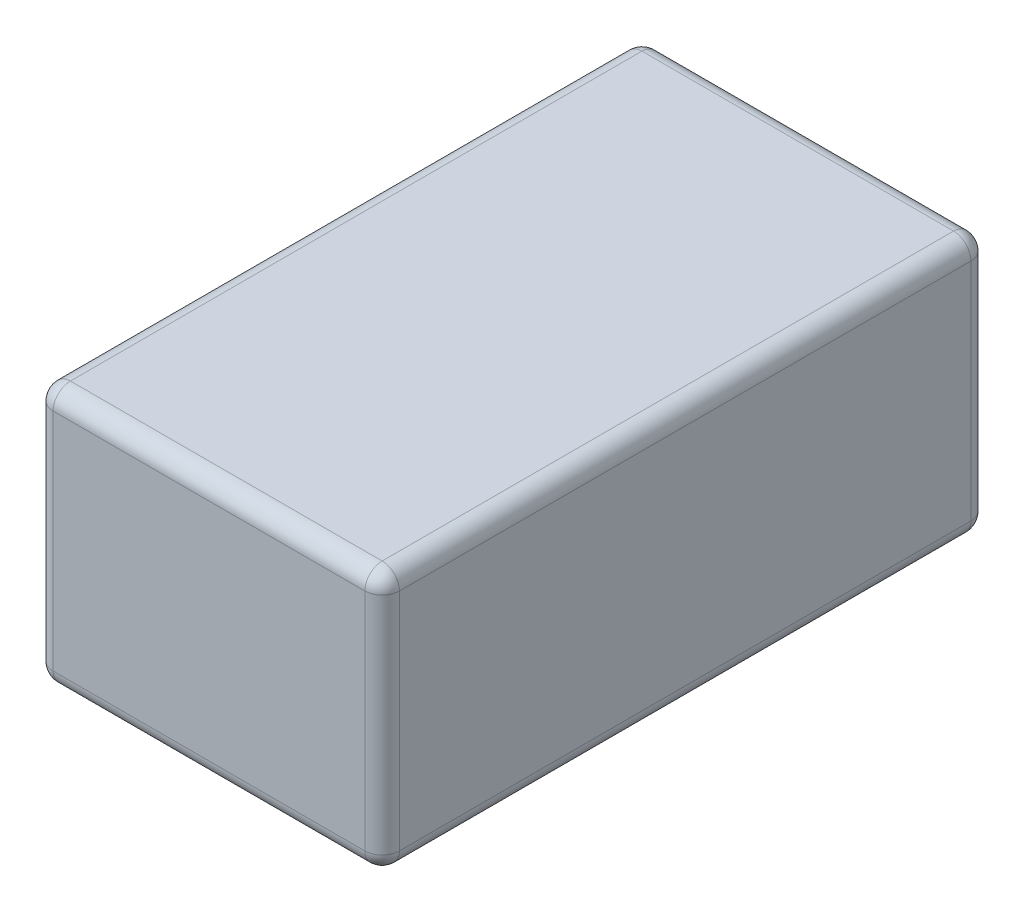
ISO-10303-21;
HEADER;
FILE_DESCRIPTION(('STEP AP214'),'2;1');
FILE_NAME('part.step','',(''),(''),'','','');
FILE_SCHEMA(('AUTOMOTIVE_DESIGN { 1 0 10303 214 1 1 1 1 }'));
ENDSEC;
DATA;
#1=APPLICATION_CONTEXT('core data for automotive mechanical design processes');
#2=APPLICATION_PROTOCOL_DEFINITION('international standard','automotive_design',2000,#1);
#3=PRODUCT_CONTEXT('',#1,'mechanical');
#4=PRODUCT('Part','Part','',(#3));
#5=PRODUCT_RELATED_PRODUCT_CATEGORY('part','',(#4));
#6=PRODUCT_DEFINITION_FORMATION('','',#4);
#7=PRODUCT_DEFINITION_CONTEXT('part definition',#1,'design');
#8=PRODUCT_DEFINITION('design','',#6,#7);
#9=PRODUCT_DEFINITION_SHAPE('','',#8);
#10=(LENGTH_UNIT() NAMED_UNIT(*) SI_UNIT(.MILLI.,.METRE.));
#11=(NAMED_UNIT(*) PLANE_ANGLE_UNIT() SI_UNIT($,.RADIAN.));
#12=(NAMED_UNIT(*) SI_UNIT($,.STERADIAN.) SOLID_ANGLE_UNIT());
#13=UNCERTAINTY_MEASURE_WITH_UNIT(LENGTH_MEASURE(1.E-05),#10,'distance_accuracy_value','');
#14=(GEOMETRIC_REPRESENTATION_CONTEXT(3) GLOBAL_UNCERTAINTY_ASSIGNED_CONTEXT((#13)) GLOBAL_UNIT_ASSIGNED_CONTEXT((#10,
#11,#12)) REPRESENTATION_CONTEXT('',''));
#15=CARTESIAN_POINT('',(0.,0.,0.));
#16=DIRECTION('',(0.,0.,1.));
#17=DIRECTION('',(1.,0.,0.));
#18=AXIS2_PLACEMENT_3D('',#15,#16,#17);
#19=CARTESIAN_POINT('',(-10.,7.5,-17.5));
#20=DIRECTION('',(1.,0.,0.));
#21=DIRECTION('',(0.,0.,-1.));
#22=AXIS2_PLACEMENT_3D('',#19,#20,#21);
#23=PLANE('',#22);
#24=DIRECTION('',(0.,-1.,0.));
#25=VECTOR('',#24,1.);
#26=CARTESIAN_POINT('',(-10.,7.5,-16.5));
#27=LINE('',#26,#25);
#28=CARTESIAN_POINT('',(-10.,6.5,-16.5));
#29=VERTEX_POINT('',#28);
#30=CARTESIAN_POINT('',(-10.,-6.5,-16.5));
#31=VERTEX_POINT('',#30);
#32=EDGE_CURVE('E145',#29,#31,#27,.T.);
#33=ORIENTED_EDGE('',*,*,#32,.T.);
#34=DIRECTION('',(0.,0.,1.));
#35=VECTOR('',#34,1.);
#36=CARTESIAN_POINT('',(-10.,-6.5,-17.5));
#37=LINE('',#36,#35);
#38=CARTESIAN_POINT('',(-9.99999999999999,-6.5,16.5));
#39=VERTEX_POINT('',#38);
#40=EDGE_CURVE('E183',#31,#39,#37,.T.);
#41=ORIENTED_EDGE('',*,*,#40,.T.);
#42=DIRECTION('',(0.,-1.,0.));
#43=VECTOR('',#42,1.);
#44=CARTESIAN_POINT('',(-9.99999999999999,7.5,16.5));
#45=LINE('',#44,#43);
#46=CARTESIAN_POINT('',(-9.99999999999999,6.5,16.5));
#47=VERTEX_POINT('',#46);
#48=EDGE_CURVE('E180',#39,#47,#45,.F.);
#49=ORIENTED_EDGE('',*,*,#48,.T.);
#50=DIRECTION('',(0.,0.,1.));
#51=VECTOR('',#50,1.);
#52=CARTESIAN_POINT('',(-10.,6.5,-17.5));
#53=LINE('',#52,#51);
#54=EDGE_CURVE('E178',#47,#29,#53,.F.);
#55=ORIENTED_EDGE('',*,*,#54,.T.);
#56=EDGE_LOOP('',(#33,#41,#49,#55));
#57=FACE_BOUND('',#56,.T.);
#58=ADVANCED_FACE('F37',(#57),#23,.F.);
#59=CARTESIAN_POINT('',(-9.99999999999999,7.5,17.5));
#60=DIRECTION('',(0.,0.,-1.));
#61=DIRECTION('',(-1.,0.,0.));
#62=AXIS2_PLACEMENT_3D('',#59,#60,#61);
#63=PLANE('',#62);
#64=DIRECTION('',(0.,-1.,0.));
#65=VECTOR('',#64,1.);
#66=CARTESIAN_POINT('',(-8.99999999999999,7.5,17.5));
#67=LINE('',#66,#65);
#68=CARTESIAN_POINT('',(-8.99999999999999,6.5,17.5));
#69=VERTEX_POINT('',#68);
#70=CARTESIAN_POINT('',(-8.99999999999999,-6.5,17.5));
#71=VERTEX_POINT('',#70);
#72=EDGE_CURVE('E189',#69,#71,#67,.T.);
#73=ORIENTED_EDGE('',*,*,#72,.T.);
#74=DIRECTION('',(1.,0.,0.));
#75=VECTOR('',#74,1.);
#76=CARTESIAN_POINT('',(-9.99999999999999,-6.5,17.5));
#77=LINE('',#76,#75);
#78=CARTESIAN_POINT('',(9.00000000000001,-6.5,17.5));
#79=VERTEX_POINT('',#78);
#80=EDGE_CURVE('E192',#71,#79,#77,.T.);
#81=ORIENTED_EDGE('',*,*,#80,.T.);
#82=DIRECTION('',(0.,-1.,0.));
#83=VECTOR('',#82,1.);
#84=CARTESIAN_POINT('',(9.00000000000001,7.5,17.5));
#85=LINE('',#84,#83);
#86=CARTESIAN_POINT('',(9.00000000000001,6.5,17.5));
#87=VERTEX_POINT('',#86);
#88=EDGE_CURVE('E187',#79,#87,#85,.F.);
#89=ORIENTED_EDGE('',*,*,#88,.T.);
#90=DIRECTION('',(1.,0.,0.));
#91=VECTOR('',#90,1.);
#92=CARTESIAN_POINT('',(-9.99999999999999,6.5,17.5));
#93=LINE('',#92,#91);
#94=EDGE_CURVE('E185',#87,#69,#93,.F.);
#95=ORIENTED_EDGE('',*,*,#94,.T.);
#96=EDGE_LOOP('',(#73,#81,#89,#95));
#97=FACE_BOUND('',#96,.T.);
#98=ADVANCED_FACE('F297',(#97),#63,.F.);
#99=CARTESIAN_POINT('',(10.,7.5,-17.5));
#100=DIRECTION('',(-1.,0.,0.));
#101=DIRECTION('',(0.,0.,1.));
#102=AXIS2_PLACEMENT_3D('',#99,#100,#101);
#103=PLANE('',#102);
#104=DIRECTION('',(0.,-1.,0.));
#105=VECTOR('',#104,1.);
#106=CARTESIAN_POINT('',(10.,7.5,16.5));
#107=LINE('',#106,#105);
#108=CARTESIAN_POINT('',(10.,6.5,16.5));
#109=VERTEX_POINT('',#108);
#110=CARTESIAN_POINT('',(10.,-6.5,16.5));
#111=VERTEX_POINT('',#110);
#112=EDGE_CURVE('E171',#109,#111,#107,.T.);
#113=ORIENTED_EDGE('',*,*,#112,.T.);
#114=DIRECTION('',(0.,0.,-1.));
#115=VECTOR('',#114,1.);
#116=CARTESIAN_POINT('',(10.,-6.5,-17.5));
#117=LINE('',#116,#115);
#118=CARTESIAN_POINT('',(10.,-6.5,-16.5));
#119=VERTEX_POINT('',#118);
#120=EDGE_CURVE('E176',#111,#119,#117,.T.);
#121=ORIENTED_EDGE('',*,*,#120,.T.);
#122=DIRECTION('',(0.,-1.,0.));
#123=VECTOR('',#122,1.);
#124=CARTESIAN_POINT('',(10.,7.5,-16.5));
#125=LINE('',#124,#123);
#126=CARTESIAN_POINT('',(10.,6.5,-16.5));
#127=VERTEX_POINT('',#126);
#128=EDGE_CURVE('E173',#119,#127,#125,.F.);
#129=ORIENTED_EDGE('',*,*,#128,.T.);
#130=DIRECTION('',(0.,0.,-1.));
#131=VECTOR('',#130,1.);
#132=CARTESIAN_POINT('',(10.,6.5,17.5));
#133=LINE('',#132,#131);
#134=EDGE_CURVE('E169',#127,#109,#133,.F.);
#135=ORIENTED_EDGE('',*,*,#134,.T.);
#136=EDGE_LOOP('',(#113,#121,#129,#135));
#137=FACE_BOUND('',#136,.T.);
#138=ADVANCED_FACE('F288',(#137),#103,.F.);
#139=CARTESIAN_POINT('',(-10.,7.5,-17.5));
#140=DIRECTION('',(0.,0.,1.));
#141=DIRECTION('',(1.,0.,0.));
#142=AXIS2_PLACEMENT_3D('',#139,#140,#141);
#143=PLANE('',#142);
#144=DIRECTION('',(0.,-1.,0.));
#145=VECTOR('',#144,1.);
#146=CARTESIAN_POINT('',(9.,7.5,-17.5));
#147=LINE('',#146,#145);
#148=CARTESIAN_POINT('',(9.,6.5,-17.5));
#149=VERTEX_POINT('',#148);
#150=CARTESIAN_POINT('',(9.,-6.5,-17.5));
#151=VERTEX_POINT('',#150);
#152=EDGE_CURVE('E137',#149,#151,#147,.T.);
#153=ORIENTED_EDGE('',*,*,#152,.T.);
#154=DIRECTION('',(-1.,0.,0.));
#155=VECTOR('',#154,1.);
#156=CARTESIAN_POINT('',(-10.,-6.5,-17.5));
#157=LINE('',#156,#155);
#158=CARTESIAN_POINT('',(-9.,-6.5,-17.5));
#159=VERTEX_POINT('',#158);
#160=EDGE_CURVE('E133',#151,#159,#157,.T.);
#161=ORIENTED_EDGE('',*,*,#160,.T.);
#162=DIRECTION('',(0.,-1.,0.));
#163=VECTOR('',#162,1.);
#164=CARTESIAN_POINT('',(-9.,7.5,-17.5));
#165=LINE('',#164,#163);
#166=CARTESIAN_POINT('',(-9.,6.5,-17.5));
#167=VERTEX_POINT('',#166);
#168=EDGE_CURVE('E125',#159,#167,#165,.F.);
#169=ORIENTED_EDGE('',*,*,#168,.T.);
#170=DIRECTION('',(-1.,0.,0.));
#171=VECTOR('',#170,1.);
#172=CARTESIAN_POINT('',(10.,6.5,-17.5));
#173=LINE('',#172,#171);
#174=EDGE_CURVE('E130',#167,#149,#173,.F.);
#175=ORIENTED_EDGE('',*,*,#174,.T.);
#176=EDGE_LOOP('',(#153,#161,#169,#175));
#177=FACE_BOUND('',#176,.T.);
#178=ADVANCED_FACE('F128',(#177),#143,.F.);
#179=CARTESIAN_POINT('',(-9.99999999999999,7.5,17.5));
#180=DIRECTION('',(0.,1.,0.));
#181=DIRECTION('',(0.,0.,1.));
#182=AXIS2_PLACEMENT_3D('',#179,#180,#181);
#183=PLANE('',#182);
#184=DIRECTION('',(0.,0.,-1.));
#185=VECTOR('',#184,1.);
#186=CARTESIAN_POINT('',(9.,7.5,-17.5));
#187=LINE('',#186,#185);
#188=CARTESIAN_POINT('',(9.00000000000001,7.5,16.5));
#189=VERTEX_POINT('',#188);
#190=CARTESIAN_POINT('',(9.,7.5,-16.5));
#191=VERTEX_POINT('',#190);
#192=EDGE_CURVE('E46',#189,#191,#187,.T.);
#193=ORIENTED_EDGE('',*,*,#192,.T.);
#194=DIRECTION('',(-1.,0.,0.));
#195=VECTOR('',#194,1.);
#196=CARTESIAN_POINT('',(-10.,7.5,-16.5));
#197=LINE('',#196,#195);
#198=CARTESIAN_POINT('',(-9.,7.5,-16.5));
#199=VERTEX_POINT('',#198);
#200=EDGE_CURVE('E11',#191,#199,#197,.T.);
#201=ORIENTED_EDGE('',*,*,#200,.T.);
#202=DIRECTION('',(0.,0.,1.));
#203=VECTOR('',#202,1.);
#204=CARTESIAN_POINT('',(-8.99999999999999,7.5,17.5));
#205=LINE('',#204,#203);
#206=CARTESIAN_POINT('',(-8.99999999999999,7.5,16.5));
#207=VERTEX_POINT('',#206);
#208=EDGE_CURVE('E203',#199,#207,#205,.T.);
#209=ORIENTED_EDGE('',*,*,#208,.T.);
#210=DIRECTION('',(1.,0.,0.));
#211=VECTOR('',#210,1.);
#212=CARTESIAN_POINT('',(10.,7.5,16.5));
#213=LINE('',#212,#211);
#214=EDGE_CURVE('E57',#207,#189,#213,.T.);
#215=ORIENTED_EDGE('',*,*,#214,.T.);
#216=EDGE_LOOP('',(#193,#201,#209,#215));
#217=FACE_BOUND('',#216,.T.);
#218=ADVANCED_FACE('F310',(#217),#183,.T.);
#219=CARTESIAN_POINT('',(-9.99999999999999,-7.5,17.5));
#220=DIRECTION('',(0.,1.,0.));
#221=DIRECTION('',(0.,0.,1.));
#222=AXIS2_PLACEMENT_3D('',#219,#220,#221);
#223=PLANE('',#222);
#224=DIRECTION('',(0.,0.,-1.));
#225=VECTOR('',#224,1.);
#226=CARTESIAN_POINT('',(9.00000000000001,-7.5,17.5));
#227=LINE('',#226,#225);
#228=CARTESIAN_POINT('',(9.,-7.5,-16.5));
#229=VERTEX_POINT('',#228);
#230=CARTESIAN_POINT('',(9.00000000000001,-7.5,16.5));
#231=VERTEX_POINT('',#230);
#232=EDGE_CURVE('E198',#229,#231,#227,.F.);
#233=ORIENTED_EDGE('',*,*,#232,.T.);
#234=DIRECTION('',(1.,0.,0.));
#235=VECTOR('',#234,1.);
#236=CARTESIAN_POINT('',(-9.99999999999999,-7.5,16.5));
#237=LINE('',#236,#235);
#238=CARTESIAN_POINT('',(-8.99999999999999,-7.5,16.5));
#239=VERTEX_POINT('',#238);
#240=EDGE_CURVE('E200',#231,#239,#237,.F.);
#241=ORIENTED_EDGE('',*,*,#240,.T.);
#242=DIRECTION('',(0.,0.,1.));
#243=VECTOR('',#242,1.);
#244=CARTESIAN_POINT('',(-8.99999999999999,-7.5,17.5));
#245=LINE('',#244,#243);
#246=CARTESIAN_POINT('',(-9.,-7.5,-16.5));
#247=VERTEX_POINT('',#246);
#248=EDGE_CURVE('E194',#239,#247,#245,.F.);
#249=ORIENTED_EDGE('',*,*,#248,.T.);
#250=DIRECTION('',(-1.,0.,0.));
#251=VECTOR('',#250,1.);
#252=CARTESIAN_POINT('',(-9.99999999999999,-7.5,-16.5));
#253=LINE('',#252,#251);
#254=EDGE_CURVE('E196',#247,#229,#253,.F.);
#255=ORIENTED_EDGE('',*,*,#254,.T.);
#256=EDGE_LOOP('',(#233,#241,#249,#255));
#257=FACE_BOUND('',#256,.T.);
#258=ADVANCED_FACE('F270',(#257),#223,.F.);
#259=CARTESIAN_POINT('',(-8.99999999999999,7.5,16.5));
#260=DIRECTION('',(0.,-1.,0.));
#261=DIRECTION('',(0.,0.,-1.));
#262=AXIS2_PLACEMENT_3D('',#259,#260,#261);
#263=CYLINDRICAL_SURFACE('',#262,1.);
#264=CARTESIAN_POINT('',(-8.99999999999999,6.5,16.5));
#265=DIRECTION('',(0.,1.,0.));
#266=DIRECTION('',(0.,0.,1.));
#267=AXIS2_PLACEMENT_3D('',#264,#265,#266);
#268=CIRCLE('',#267,1.);
#269=EDGE_CURVE('E41',#47,#69,#268,.T.);
#270=ORIENTED_EDGE('',*,*,#269,.F.);
#271=ORIENTED_EDGE('',*,*,#48,.F.);
#272=CARTESIAN_POINT('',(-8.99999999999999,-6.5,16.5));
#273=DIRECTION('',(0.,-1.,0.));
#274=DIRECTION('',(0.,0.,-1.));
#275=AXIS2_PLACEMENT_3D('',#272,#273,#274);
#276=CIRCLE('',#275,1.);
#277=EDGE_CURVE('E165',#71,#39,#276,.T.);
#278=ORIENTED_EDGE('',*,*,#277,.F.);
#279=ORIENTED_EDGE('',*,*,#72,.F.);
#280=EDGE_LOOP('',(#270,#271,#278,#279));
#281=FACE_BOUND('',#280,.T.);
#282=ADVANCED_FACE('F39',(#281),#263,.T.);
#283=CARTESIAN_POINT('',(-8.99999999999999,6.5,16.5));
#284=DIRECTION('',(0.,0.,1.));
#285=DIRECTION('',(1.,0.,0.));
#286=AXIS2_PLACEMENT_3D('',#283,#284,#285);
#287=SPHERICAL_SURFACE('',#286,1.);
#288=CARTESIAN_POINT('',(-8.99999999999999,6.5,16.5));
#289=DIRECTION('',(0.,0.,1.));
#290=DIRECTION('',(1.,0.,0.));
#291=AXIS2_PLACEMENT_3D('',#288,#289,#290);
#292=CIRCLE('',#291,1.);
#293=EDGE_CURVE('E250',#47,#207,#292,.F.);
#294=ORIENTED_EDGE('',*,*,#293,.F.);
#295=ORIENTED_EDGE('',*,*,#269,.T.);
#296=CARTESIAN_POINT('',(-8.99999999999999,6.5,16.5));
#297=DIRECTION('',(-1.,0.,0.));
#298=DIRECTION('',(0.,0.,1.));
#299=AXIS2_PLACEMENT_3D('',#296,#297,#298);
#300=CIRCLE('',#299,1.);
#301=EDGE_CURVE('E253',#207,#69,#300,.F.);
#302=ORIENTED_EDGE('',*,*,#301,.F.);
#303=EDGE_LOOP('',(#294,#295,#302));
#304=FACE_BOUND('',#303,.T.);
#305=ADVANCED_FACE('F304',(#304),#287,.T.);
#306=CARTESIAN_POINT('',(-8.99999999999999,-6.5,16.5));
#307=DIRECTION('',(0.,0.,1.));
#308=DIRECTION('',(1.,0.,0.));
#309=AXIS2_PLACEMENT_3D('',#306,#307,#308);
#310=SPHERICAL_SURFACE('',#309,1.);
#311=CARTESIAN_POINT('',(-8.99999999999999,-6.5,16.5));
#312=DIRECTION('',(-1.,0.,0.));
#313=DIRECTION('',(0.,0.,1.));
#314=AXIS2_PLACEMENT_3D('',#311,#312,#313);
#315=CIRCLE('',#314,1.);
#316=EDGE_CURVE('E244',#71,#239,#315,.F.);
#317=ORIENTED_EDGE('',*,*,#316,.F.);
#318=ORIENTED_EDGE('',*,*,#277,.T.);
#319=CARTESIAN_POINT('',(-8.99999999999999,-6.5,16.5));
#320=DIRECTION('',(0.,0.,1.));
#321=DIRECTION('',(1.,0.,0.));
#322=AXIS2_PLACEMENT_3D('',#319,#320,#321);
#323=CIRCLE('',#322,1.);
#324=EDGE_CURVE('E247',#239,#39,#323,.F.);
#325=ORIENTED_EDGE('',*,*,#324,.F.);
#326=EDGE_LOOP('',(#317,#318,#325));
#327=FACE_BOUND('',#326,.T.);
#328=ADVANCED_FACE('F260',(#327),#310,.T.);
#329=CARTESIAN_POINT('',(-9.99999999999999,6.5,16.5));
#330=DIRECTION('',(-1.,0.,0.));
#331=DIRECTION('',(0.,0.,1.));
#332=AXIS2_PLACEMENT_3D('',#329,#330,#331);
#333=CYLINDRICAL_SURFACE('',#332,1.);
#334=ORIENTED_EDGE('',*,*,#301,.T.);
#335=ORIENTED_EDGE('',*,*,#94,.F.);
#336=CARTESIAN_POINT('',(9.00000000000001,6.5,16.5));
#337=DIRECTION('',(1.,0.,0.));
#338=DIRECTION('',(0.,0.,-1.));
#339=AXIS2_PLACEMENT_3D('',#336,#337,#338);
#340=CIRCLE('',#339,1.);
#341=EDGE_CURVE('E238',#189,#87,#340,.T.);
#342=ORIENTED_EDGE('',*,*,#341,.F.);
#343=ORIENTED_EDGE('',*,*,#214,.F.);
#344=EDGE_LOOP('',(#334,#335,#342,#343));
#345=FACE_BOUND('',#344,.T.);
#346=ADVANCED_FACE('F299',(#345),#333,.T.);
#347=CARTESIAN_POINT('',(-8.99999999999999,6.5,17.5));
#348=DIRECTION('',(0.,0.,-1.));
#349=DIRECTION('',(-1.,0.,0.));
#350=AXIS2_PLACEMENT_3D('',#347,#348,#349);
#351=CYLINDRICAL_SURFACE('',#350,1.);
#352=ORIENTED_EDGE('',*,*,#293,.T.);
#353=ORIENTED_EDGE('',*,*,#208,.F.);
#354=CARTESIAN_POINT('',(-9.,6.5,-16.5));
#355=DIRECTION('',(0.,0.,-1.));
#356=DIRECTION('',(-1.,0.,0.));
#357=AXIS2_PLACEMENT_3D('',#354,#355,#356);
#358=CIRCLE('',#357,1.);
#359=EDGE_CURVE('E149',#29,#199,#358,.T.);
#360=ORIENTED_EDGE('',*,*,#359,.F.);
#361=ORIENTED_EDGE('',*,*,#54,.F.);
#362=EDGE_LOOP('',(#352,#353,#360,#361));
#363=FACE_BOUND('',#362,.T.);
#364=ADVANCED_FACE('F309',(#363),#351,.T.);
#365=CARTESIAN_POINT('',(-9.,7.5,-16.5));
#366=DIRECTION('',(0.,-1.,0.));
#367=DIRECTION('',(0.,0.,-1.));
#368=AXIS2_PLACEMENT_3D('',#365,#366,#367);
#369=CYLINDRICAL_SURFACE('',#368,1.);
#370=CARTESIAN_POINT('',(-9.,-6.5,-16.5));
#371=DIRECTION('',(0.,-1.,0.));
#372=DIRECTION('',(0.,0.,-1.));
#373=AXIS2_PLACEMENT_3D('',#370,#371,#372);
#374=CIRCLE('',#373,1.);
#375=EDGE_CURVE('E150',#31,#159,#374,.T.);
#376=ORIENTED_EDGE('',*,*,#375,.F.);
#377=ORIENTED_EDGE('',*,*,#32,.F.);
#378=CARTESIAN_POINT('',(-9.,6.5,-16.5));
#379=DIRECTION('',(0.,1.,0.));
#380=DIRECTION('',(0.,0.,1.));
#381=AXIS2_PLACEMENT_3D('',#378,#379,#380);
#382=CIRCLE('',#381,1.);
#383=EDGE_CURVE('E141',#167,#29,#382,.T.);
#384=ORIENTED_EDGE('',*,*,#383,.F.);
#385=ORIENTED_EDGE('',*,*,#168,.F.);
#386=EDGE_LOOP('',(#376,#377,#384,#385));
#387=FACE_BOUND('',#386,.T.);
#388=ADVANCED_FACE('F143',(#387),#369,.T.);
#389=CARTESIAN_POINT('',(-9.,-6.5,-17.5));
#390=DIRECTION('',(0.,0.,1.));
#391=DIRECTION('',(1.,0.,0.));
#392=AXIS2_PLACEMENT_3D('',#389,#390,#391);
#393=CYLINDRICAL_SURFACE('',#392,1.);
#394=ORIENTED_EDGE('',*,*,#324,.T.);
#395=ORIENTED_EDGE('',*,*,#40,.F.);
#396=CARTESIAN_POINT('',(-9.,-6.5,-16.5));
#397=DIRECTION('',(0.,0.,-1.));
#398=DIRECTION('',(-1.,0.,0.));
#399=AXIS2_PLACEMENT_3D('',#396,#397,#398);
#400=CIRCLE('',#399,1.);
#401=EDGE_CURVE('E234',#247,#31,#400,.T.);
#402=ORIENTED_EDGE('',*,*,#401,.F.);
#403=ORIENTED_EDGE('',*,*,#248,.F.);
#404=EDGE_LOOP('',(#394,#395,#402,#403));
#405=FACE_BOUND('',#404,.T.);
#406=ADVANCED_FACE('F266',(#405),#393,.T.);
#407=CARTESIAN_POINT('',(-9.99999999999999,-6.5,16.5));
#408=DIRECTION('',(1.,0.,0.));
#409=DIRECTION('',(0.,0.,-1.));
#410=AXIS2_PLACEMENT_3D('',#407,#408,#409);
#411=CYLINDRICAL_SURFACE('',#410,1.);
#412=ORIENTED_EDGE('',*,*,#316,.T.);
#413=ORIENTED_EDGE('',*,*,#240,.F.);
#414=CARTESIAN_POINT('',(9.00000000000001,-6.5,16.5));
#415=DIRECTION('',(1.,0.,0.));
#416=DIRECTION('',(0.,0.,-1.));
#417=AXIS2_PLACEMENT_3D('',#414,#415,#416);
#418=CIRCLE('',#417,1.);
#419=EDGE_CURVE('E231',#79,#231,#418,.T.);
#420=ORIENTED_EDGE('',*,*,#419,.F.);
#421=ORIENTED_EDGE('',*,*,#80,.F.);
#422=EDGE_LOOP('',(#412,#413,#420,#421));
#423=FACE_BOUND('',#422,.T.);
#424=ADVANCED_FACE('F276',(#423),#411,.T.);
#425=CARTESIAN_POINT('',(9.00000000000001,7.5,16.5));
#426=DIRECTION('',(0.,-1.,0.));
#427=DIRECTION('',(0.,0.,-1.));
#428=AXIS2_PLACEMENT_3D('',#425,#426,#427);
#429=CYLINDRICAL_SURFACE('',#428,1.);
#430=CARTESIAN_POINT('',(9.00000000000001,6.5,16.5));
#431=DIRECTION('',(0.,1.,0.));
#432=DIRECTION('',(0.,0.,1.));
#433=AXIS2_PLACEMENT_3D('',#430,#431,#432);
#434=CIRCLE('',#433,1.);
#435=EDGE_CURVE('E241',#87,#109,#434,.T.);
#436=ORIENTED_EDGE('',*,*,#435,.F.);
#437=ORIENTED_EDGE('',*,*,#88,.F.);
#438=CARTESIAN_POINT('',(9.00000000000001,-6.5,16.5));
#439=DIRECTION('',(0.,-1.,0.));
#440=DIRECTION('',(0.,0.,-1.));
#441=AXIS2_PLACEMENT_3D('',#438,#439,#440);
#442=CIRCLE('',#441,1.);
#443=EDGE_CURVE('E228',#111,#79,#442,.T.);
#444=ORIENTED_EDGE('',*,*,#443,.F.);
#445=ORIENTED_EDGE('',*,*,#112,.F.);
#446=EDGE_LOOP('',(#436,#437,#444,#445));
#447=FACE_BOUND('',#446,.T.);
#448=ADVANCED_FACE('F294',(#447),#429,.T.);
#449=CARTESIAN_POINT('',(9.00000000000001,6.5,16.5));
#450=DIRECTION('',(0.,0.,1.));
#451=DIRECTION('',(1.,0.,0.));
#452=AXIS2_PLACEMENT_3D('',#449,#450,#451);
#453=SPHERICAL_SURFACE('',#452,1.);
#454=ORIENTED_EDGE('',*,*,#341,.T.);
#455=ORIENTED_EDGE('',*,*,#435,.T.);
#456=CARTESIAN_POINT('',(9.00000000000001,6.5,16.5));
#457=DIRECTION('',(0.,0.,1.));
#458=DIRECTION('',(1.,0.,0.));
#459=AXIS2_PLACEMENT_3D('',#456,#457,#458);
#460=CIRCLE('',#459,1.);
#461=EDGE_CURVE('E156',#189,#109,#460,.F.);
#462=ORIENTED_EDGE('',*,*,#461,.F.);
#463=EDGE_LOOP('',(#454,#455,#462));
#464=FACE_BOUND('',#463,.T.);
#465=ADVANCED_FACE('F333',(#464),#453,.T.);
#466=CARTESIAN_POINT('',(-9.,6.5,-16.5));
#467=DIRECTION('',(0.,0.,1.));
#468=DIRECTION('',(1.,0.,0.));
#469=AXIS2_PLACEMENT_3D('',#466,#467,#468);
#470=SPHERICAL_SURFACE('',#469,1.);
#471=ORIENTED_EDGE('',*,*,#383,.T.);
#472=ORIENTED_EDGE('',*,*,#359,.T.);
#473=CARTESIAN_POINT('',(-9.,6.5,-16.5));
#474=DIRECTION('',(-1.,0.,0.));
#475=DIRECTION('',(0.,0.,1.));
#476=AXIS2_PLACEMENT_3D('',#473,#474,#475);
#477=CIRCLE('',#476,1.);
#478=EDGE_CURVE('E152',#167,#199,#477,.F.);
#479=ORIENTED_EDGE('',*,*,#478,.F.);
#480=EDGE_LOOP('',(#471,#472,#479));
#481=FACE_BOUND('',#480,.T.);
#482=ADVANCED_FACE('F153',(#481),#470,.T.);
#483=CARTESIAN_POINT('',(-9.,-6.5,-16.5));
#484=DIRECTION('',(0.,0.,1.));
#485=DIRECTION('',(1.,0.,0.));
#486=AXIS2_PLACEMENT_3D('',#483,#484,#485);
#487=SPHERICAL_SURFACE('',#486,1.);
#488=ORIENTED_EDGE('',*,*,#401,.T.);
#489=ORIENTED_EDGE('',*,*,#375,.T.);
#490=CARTESIAN_POINT('',(-9.,-6.5,-16.5));
#491=DIRECTION('',(-1.,0.,0.));
#492=DIRECTION('',(0.,0.,1.));
#493=AXIS2_PLACEMENT_3D('',#490,#491,#492);
#494=CIRCLE('',#493,1.);
#495=EDGE_CURVE('E157',#247,#159,#494,.F.);
#496=ORIENTED_EDGE('',*,*,#495,.F.);
#497=EDGE_LOOP('',(#488,#489,#496));
#498=FACE_BOUND('',#497,.T.);
#499=ADVANCED_FACE('F325',(#498),#487,.T.);
#500=CARTESIAN_POINT('',(9.00000000000001,-6.5,16.5));
#501=DIRECTION('',(0.,0.,1.));
#502=DIRECTION('',(1.,0.,0.));
#503=AXIS2_PLACEMENT_3D('',#500,#501,#502);
#504=SPHERICAL_SURFACE('',#503,1.);
#505=ORIENTED_EDGE('',*,*,#443,.T.);
#506=ORIENTED_EDGE('',*,*,#419,.T.);
#507=CARTESIAN_POINT('',(9.00000000000001,-6.5,16.5));
#508=DIRECTION('',(0.,0.,1.));
#509=DIRECTION('',(1.,0.,0.));
#510=AXIS2_PLACEMENT_3D('',#507,#508,#509);
#511=CIRCLE('',#510,1.);
#512=EDGE_CURVE('E221',#111,#231,#511,.F.);
#513=ORIENTED_EDGE('',*,*,#512,.F.);
#514=EDGE_LOOP('',(#505,#506,#513));
#515=FACE_BOUND('',#514,.T.);
#516=ADVANCED_FACE('F279',(#515),#504,.T.);
#517=CARTESIAN_POINT('',(9.00000000000001,6.5,17.5));
#518=DIRECTION('',(0.,0.,1.));
#519=DIRECTION('',(1.,0.,0.));
#520=AXIS2_PLACEMENT_3D('',#517,#518,#519);
#521=CYLINDRICAL_SURFACE('',#520,1.);
#522=ORIENTED_EDGE('',*,*,#461,.T.);
#523=ORIENTED_EDGE('',*,*,#134,.F.);
#524=CARTESIAN_POINT('',(9.,6.5,-16.5));
#525=DIRECTION('',(0.,0.,-1.));
#526=DIRECTION('',(-1.,0.,0.));
#527=AXIS2_PLACEMENT_3D('',#524,#525,#526);
#528=CIRCLE('',#527,1.);
#529=EDGE_CURVE('E218',#191,#127,#528,.T.);
#530=ORIENTED_EDGE('',*,*,#529,.F.);
#531=ORIENTED_EDGE('',*,*,#192,.F.);
#532=EDGE_LOOP('',(#522,#523,#530,#531));
#533=FACE_BOUND('',#532,.T.);
#534=ADVANCED_FACE('F313',(#533),#521,.T.);
#535=CARTESIAN_POINT('',(-9.99999999999999,6.5,-16.5));
#536=DIRECTION('',(1.,0.,0.));
#537=DIRECTION('',(0.,0.,-1.));
#538=AXIS2_PLACEMENT_3D('',#535,#536,#537);
#539=CYLINDRICAL_SURFACE('',#538,1.);
#540=ORIENTED_EDGE('',*,*,#478,.T.);
#541=ORIENTED_EDGE('',*,*,#200,.F.);
#542=CARTESIAN_POINT('',(9.,6.5,-16.5));
#543=DIRECTION('',(1.,0.,0.));
#544=DIRECTION('',(0.,0.,-1.));
#545=AXIS2_PLACEMENT_3D('',#542,#543,#544);
#546=CIRCLE('',#545,1.);
#547=EDGE_CURVE('E161',#149,#191,#546,.T.);
#548=ORIENTED_EDGE('',*,*,#547,.F.);
#549=ORIENTED_EDGE('',*,*,#174,.F.);
#550=EDGE_LOOP('',(#540,#541,#548,#549));
#551=FACE_BOUND('',#550,.T.);
#552=ADVANCED_FACE('F159',(#551),#539,.T.);
#553=CARTESIAN_POINT('',(-10.,-6.5,-16.5));
#554=DIRECTION('',(-1.,0.,0.));
#555=DIRECTION('',(0.,0.,1.));
#556=AXIS2_PLACEMENT_3D('',#553,#554,#555);
#557=CYLINDRICAL_SURFACE('',#556,1.);
#558=ORIENTED_EDGE('',*,*,#495,.T.);
#559=ORIENTED_EDGE('',*,*,#160,.F.);
#560=CARTESIAN_POINT('',(9.,-6.5,-16.5));
#561=DIRECTION('',(1.,0.,0.));
#562=DIRECTION('',(0.,0.,-1.));
#563=AXIS2_PLACEMENT_3D('',#560,#561,#562);
#564=CIRCLE('',#563,1.);
#565=EDGE_CURVE('E214',#229,#151,#564,.T.);
#566=ORIENTED_EDGE('',*,*,#565,.F.);
#567=ORIENTED_EDGE('',*,*,#254,.F.);
#568=EDGE_LOOP('',(#558,#559,#566,#567));
#569=FACE_BOUND('',#568,.T.);
#570=ADVANCED_FACE('F323',(#569),#557,.T.);
#571=CARTESIAN_POINT('',(9.,-6.5,-17.5));
#572=DIRECTION('',(0.,0.,-1.));
#573=DIRECTION('',(-1.,0.,0.));
#574=AXIS2_PLACEMENT_3D('',#571,#572,#573);
#575=CYLINDRICAL_SURFACE('',#574,1.);
#576=ORIENTED_EDGE('',*,*,#512,.T.);
#577=ORIENTED_EDGE('',*,*,#232,.F.);
#578=CARTESIAN_POINT('',(9.,-6.5,-16.5));
#579=DIRECTION('',(0.,0.,-1.));
#580=DIRECTION('',(-1.,0.,0.));
#581=AXIS2_PLACEMENT_3D('',#578,#579,#580);
#582=CIRCLE('',#581,1.);
#583=EDGE_CURVE('E211',#119,#229,#582,.T.);
#584=ORIENTED_EDGE('',*,*,#583,.F.);
#585=ORIENTED_EDGE('',*,*,#120,.F.);
#586=EDGE_LOOP('',(#576,#577,#584,#585));
#587=FACE_BOUND('',#586,.T.);
#588=ADVANCED_FACE('F283',(#587),#575,.T.);
#589=CARTESIAN_POINT('',(9.,6.5,-16.5));
#590=DIRECTION('',(0.,0.,1.));
#591=DIRECTION('',(1.,0.,0.));
#592=AXIS2_PLACEMENT_3D('',#589,#590,#591);
#593=SPHERICAL_SURFACE('',#592,1.);
#594=ORIENTED_EDGE('',*,*,#547,.T.);
#595=ORIENTED_EDGE('',*,*,#529,.T.);
#596=CARTESIAN_POINT('',(9.,6.5,-16.5));
#597=DIRECTION('',(0.,1.,0.));
#598=DIRECTION('',(0.,0.,1.));
#599=AXIS2_PLACEMENT_3D('',#596,#597,#598);
#600=CIRCLE('',#599,1.);
#601=EDGE_CURVE('E209',#149,#127,#600,.F.);
#602=ORIENTED_EDGE('',*,*,#601,.F.);
#603=EDGE_LOOP('',(#594,#595,#602));
#604=FACE_BOUND('',#603,.T.);
#605=ADVANCED_FACE('F315',(#604),#593,.T.);
#606=CARTESIAN_POINT('',(9.,-6.5,-16.5));
#607=DIRECTION('',(0.,0.,1.));
#608=DIRECTION('',(1.,0.,0.));
#609=AXIS2_PLACEMENT_3D('',#606,#607,#608);
#610=SPHERICAL_SURFACE('',#609,1.);
#611=ORIENTED_EDGE('',*,*,#583,.T.);
#612=ORIENTED_EDGE('',*,*,#565,.T.);
#613=CARTESIAN_POINT('',(9.,-6.5,-16.5));
#614=DIRECTION('',(0.,-1.,0.));
#615=DIRECTION('',(0.,0.,-1.));
#616=AXIS2_PLACEMENT_3D('',#613,#614,#615);
#617=CIRCLE('',#616,1.);
#618=EDGE_CURVE('E207',#119,#151,#617,.F.);
#619=ORIENTED_EDGE('',*,*,#618,.F.);
#620=EDGE_LOOP('',(#611,#612,#619));
#621=FACE_BOUND('',#620,.T.);
#622=ADVANCED_FACE('F321',(#621),#610,.T.);
#623=CARTESIAN_POINT('',(9.,7.5,-16.5));
#624=DIRECTION('',(0.,-1.,0.));
#625=DIRECTION('',(0.,0.,-1.));
#626=AXIS2_PLACEMENT_3D('',#623,#624,#625);
#627=CYLINDRICAL_SURFACE('',#626,1.);
#628=ORIENTED_EDGE('',*,*,#601,.T.);
#629=ORIENTED_EDGE('',*,*,#128,.F.);
#630=ORIENTED_EDGE('',*,*,#618,.T.);
#631=ORIENTED_EDGE('',*,*,#152,.F.);
#632=EDGE_LOOP('',(#628,#629,#630,#631));
#633=FACE_BOUND('',#632,.T.);
#634=ADVANCED_FACE('F318',(#633),#627,.T.);
#635=CLOSED_SHELL('',(#58,#98,#138,#178,#218,#258,#282,#305,#328,#346,#364,#388,#406,#424,#448,
#465,#482,#499,#516,#534,#552,#570,#588,#605,#622,#634));
#636=MANIFOLD_SOLID_BREP('B2',#635);
#637=ADVANCED_BREP_SHAPE_REPRESENTATION('',(#18,#636),#14);
#638=SHAPE_DEFINITION_REPRESENTATION(#9,#637);
ENDSEC;
END-ISO-10303-21;
